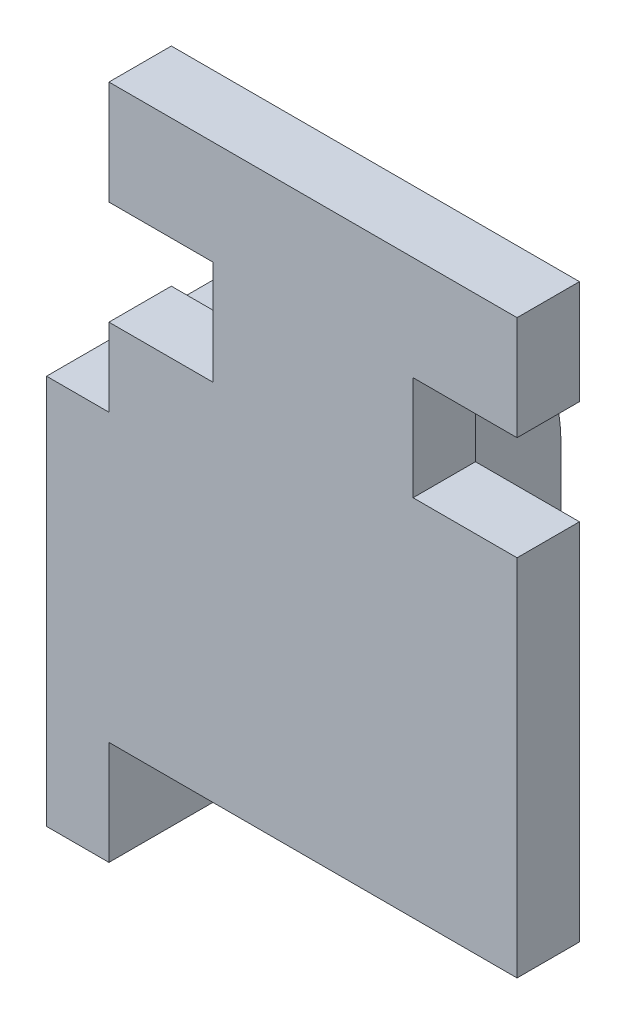
ISO-10303-21;
HEADER;
FILE_DESCRIPTION(('STEP AP214'),'2;1');
FILE_NAME('part.step','',(''),(''),'','','');
FILE_SCHEMA(('AUTOMOTIVE_DESIGN { 1 0 10303 214 1 1 1 1 }'));
ENDSEC;
DATA;
#1=APPLICATION_CONTEXT('core data for automotive mechanical design processes');
#2=APPLICATION_PROTOCOL_DEFINITION('international standard','automotive_design',2000,#1);
#3=PRODUCT_CONTEXT('',#1,'mechanical');
#4=PRODUCT('Part','Part','',(#3));
#5=PRODUCT_RELATED_PRODUCT_CATEGORY('part','',(#4));
#6=PRODUCT_DEFINITION_FORMATION('','',#4);
#7=PRODUCT_DEFINITION_CONTEXT('part definition',#1,'design');
#8=PRODUCT_DEFINITION('design','',#6,#7);
#9=PRODUCT_DEFINITION_SHAPE('','',#8);
#10=(LENGTH_UNIT() NAMED_UNIT(*) SI_UNIT(.MILLI.,.METRE.));
#11=(NAMED_UNIT(*) PLANE_ANGLE_UNIT() SI_UNIT($,.RADIAN.));
#12=(NAMED_UNIT(*) SI_UNIT($,.STERADIAN.) SOLID_ANGLE_UNIT());
#13=UNCERTAINTY_MEASURE_WITH_UNIT(LENGTH_MEASURE(1.E-05),#10,'distance_accuracy_value','');
#14=(GEOMETRIC_REPRESENTATION_CONTEXT(3) GLOBAL_UNCERTAINTY_ASSIGNED_CONTEXT((#13)) GLOBAL_UNIT_ASSIGNED_CONTEXT((#10,
#11,#12)) REPRESENTATION_CONTEXT('',''));
#15=CARTESIAN_POINT('',(0.,0.,0.));
#16=DIRECTION('',(0.,0.,1.));
#17=DIRECTION('',(1.,0.,0.));
#18=AXIS2_PLACEMENT_3D('',#15,#16,#17);
#19=CARTESIAN_POINT('',(0.,0.,0.24));
#20=DIRECTION('',(1.,0.,0.));
#21=DIRECTION('',(0.,0.,-1.));
#22=AXIS2_PLACEMENT_3D('',#19,#20,#21);
#23=PLANE('',#22);
#24=DIRECTION('',(0.,0.,-1.));
#25=VECTOR('',#24,1.);
#26=CARTESIAN_POINT('',(0.,1.1,-1.5));
#27=LINE('',#26,#25);
#28=CARTESIAN_POINT('',(0.,1.1,0.24));
#29=VERTEX_POINT('',#28);
#30=CARTESIAN_POINT('',(0.,1.1,0.));
#31=VERTEX_POINT('',#30);
#32=EDGE_CURVE('E285',#29,#31,#27,.T.);
#33=ORIENTED_EDGE('',*,*,#32,.F.);
#34=DIRECTION('',(0.,-1.,0.));
#35=VECTOR('',#34,1.);
#36=CARTESIAN_POINT('',(0.,0.,0.24));
#37=LINE('',#36,#35);
#38=CARTESIAN_POINT('',(0.,1.4,0.24));
#39=VERTEX_POINT('',#38);
#40=EDGE_CURVE('E177',#39,#29,#37,.T.);
#41=ORIENTED_EDGE('',*,*,#40,.F.);
#42=DIRECTION('',(0.,0.,-1.));
#43=VECTOR('',#42,1.);
#44=CARTESIAN_POINT('',(0.,1.4,0.24));
#45=LINE('',#44,#43);
#46=CARTESIAN_POINT('',(0.,1.4,0.));
#47=VERTEX_POINT('',#46);
#48=EDGE_CURVE('E238',#39,#47,#45,.T.);
#49=ORIENTED_EDGE('',*,*,#48,.T.);
#50=DIRECTION('',(0.,-1.,0.));
#51=VECTOR('',#50,1.);
#52=CARTESIAN_POINT('',(0.,0.,0.));
#53=LINE('',#52,#51);
#54=EDGE_CURVE('E192',#47,#31,#53,.T.);
#55=ORIENTED_EDGE('',*,*,#54,.T.);
#56=EDGE_LOOP('',(#33,#41,#49,#55));
#57=FACE_BOUND('',#56,.T.);
#58=ADVANCED_FACE('F34',(#57),#23,.F.);
#59=CARTESIAN_POINT('',(1.57,0.,0.24));
#60=DIRECTION('',(0.,1.,0.));
#61=DIRECTION('',(-1.,0.,0.));
#62=AXIS2_PLACEMENT_3D('',#59,#60,#61);
#63=PLANE('',#62);
#64=DIRECTION('',(1.,0.,0.));
#65=VECTOR('',#64,1.);
#66=CARTESIAN_POINT('',(1.57,0.,0.));
#67=LINE('',#66,#65);
#68=CARTESIAN_POINT('',(0.,0.,0.));
#69=VERTEX_POINT('',#68);
#70=CARTESIAN_POINT('',(1.57,0.,0.));
#71=VERTEX_POINT('',#70);
#72=EDGE_CURVE('E178',#69,#71,#67,.T.);
#73=ORIENTED_EDGE('',*,*,#72,.T.);
#74=DIRECTION('',(0.,0.,-1.));
#75=VECTOR('',#74,1.);
#76=CARTESIAN_POINT('',(1.57,0.,0.24));
#77=LINE('',#76,#75);
#78=CARTESIAN_POINT('',(1.57,0.,0.24));
#79=VERTEX_POINT('',#78);
#80=EDGE_CURVE('E268',#79,#71,#77,.T.);
#81=ORIENTED_EDGE('',*,*,#80,.F.);
#82=DIRECTION('',(1.,0.,0.));
#83=VECTOR('',#82,1.);
#84=CARTESIAN_POINT('',(1.57,0.,0.24));
#85=LINE('',#84,#83);
#86=CARTESIAN_POINT('',(0.,0.,0.24));
#87=VERTEX_POINT('',#86);
#88=EDGE_CURVE('E189',#87,#79,#85,.T.);
#89=ORIENTED_EDGE('',*,*,#88,.F.);
#90=DIRECTION('',(0.,0.,-1.));
#91=VECTOR('',#90,1.);
#92=CARTESIAN_POINT('',(0.,0.,0.24));
#93=LINE('',#92,#91);
#94=EDGE_CURVE('E212',#87,#69,#93,.T.);
#95=ORIENTED_EDGE('',*,*,#94,.T.);
#96=EDGE_LOOP('',(#73,#81,#89,#95));
#97=FACE_BOUND('',#96,.T.);
#98=ADVANCED_FACE('F306',(#97),#63,.F.);
#99=CARTESIAN_POINT('',(1.57,1.4,0.24));
#100=DIRECTION('',(-1.,0.,0.));
#101=DIRECTION('',(0.,0.,1.));
#102=AXIS2_PLACEMENT_3D('',#99,#100,#101);
#103=PLANE('',#102);
#104=DIRECTION('',(0.,1.,0.));
#105=VECTOR('',#104,1.);
#106=CARTESIAN_POINT('',(1.57,1.4,0.));
#107=LINE('',#106,#105);
#108=CARTESIAN_POINT('',(1.57,1.4,0.));
#109=VERTEX_POINT('',#108);
#110=EDGE_CURVE('E182',#71,#109,#107,.T.);
#111=ORIENTED_EDGE('',*,*,#110,.T.);
#112=DIRECTION('',(0.,0.,-1.));
#113=VECTOR('',#112,1.);
#114=CARTESIAN_POINT('',(1.57,1.4,0.24));
#115=LINE('',#114,#113);
#116=CARTESIAN_POINT('',(1.57,1.4,0.24));
#117=VERTEX_POINT('',#116);
#118=EDGE_CURVE('E265',#117,#109,#115,.T.);
#119=ORIENTED_EDGE('',*,*,#118,.F.);
#120=DIRECTION('',(0.,1.,0.));
#121=VECTOR('',#120,1.);
#122=CARTESIAN_POINT('',(1.57,1.4,0.24));
#123=LINE('',#122,#121);
#124=EDGE_CURVE('E191',#79,#117,#123,.T.);
#125=ORIENTED_EDGE('',*,*,#124,.F.);
#126=ORIENTED_EDGE('',*,*,#80,.T.);
#127=EDGE_LOOP('',(#111,#119,#125,#126));
#128=FACE_BOUND('',#127,.T.);
#129=ADVANCED_FACE('F312',(#128),#103,.F.);
#130=CARTESIAN_POINT('',(1.17,1.4,0.24));
#131=DIRECTION('',(0.,-1.,0.));
#132=DIRECTION('',(1.,0.,0.));
#133=AXIS2_PLACEMENT_3D('',#130,#131,#132);
#134=PLANE('',#133);
#135=DIRECTION('',(-1.,0.,0.));
#136=VECTOR('',#135,1.);
#137=CARTESIAN_POINT('',(1.17,1.4,0.));
#138=LINE('',#137,#136);
#139=CARTESIAN_POINT('',(1.17,1.4,0.));
#140=VERTEX_POINT('',#139);
#141=EDGE_CURVE('E215',#109,#140,#138,.T.);
#142=ORIENTED_EDGE('',*,*,#141,.T.);
#143=DIRECTION('',(0.,0.,-1.));
#144=VECTOR('',#143,1.);
#145=CARTESIAN_POINT('',(1.17,1.4,0.24));
#146=LINE('',#145,#144);
#147=CARTESIAN_POINT('',(1.17,1.4,0.24));
#148=VERTEX_POINT('',#147);
#149=EDGE_CURVE('E262',#148,#140,#146,.T.);
#150=ORIENTED_EDGE('',*,*,#149,.F.);
#151=DIRECTION('',(-1.,0.,0.));
#152=VECTOR('',#151,1.);
#153=CARTESIAN_POINT('',(1.17,1.4,0.24));
#154=LINE('',#153,#152);
#155=EDGE_CURVE('E194',#117,#148,#154,.T.);
#156=ORIENTED_EDGE('',*,*,#155,.F.);
#157=ORIENTED_EDGE('',*,*,#118,.T.);
#158=EDGE_LOOP('',(#142,#150,#156,#157));
#159=FACE_BOUND('',#158,.T.);
#160=ADVANCED_FACE('F349',(#159),#134,.F.);
#161=CARTESIAN_POINT('',(1.17,1.8,0.24));
#162=DIRECTION('',(-1.,0.,0.));
#163=DIRECTION('',(0.,0.,1.));
#164=AXIS2_PLACEMENT_3D('',#161,#162,#163);
#165=PLANE('',#164);
#166=DIRECTION('',(0.,1.,0.));
#167=VECTOR('',#166,1.);
#168=CARTESIAN_POINT('',(1.17,1.8,0.));
#169=LINE('',#168,#167);
#170=CARTESIAN_POINT('',(1.17,1.8,0.));
#171=VERTEX_POINT('',#170);
#172=EDGE_CURVE('E217',#140,#171,#169,.T.);
#173=ORIENTED_EDGE('',*,*,#172,.T.);
#174=DIRECTION('',(0.,0.,-1.));
#175=VECTOR('',#174,1.);
#176=CARTESIAN_POINT('',(1.17,1.8,0.24));
#177=LINE('',#176,#175);
#178=CARTESIAN_POINT('',(1.17,1.8,0.24));
#179=VERTEX_POINT('',#178);
#180=EDGE_CURVE('E259',#179,#171,#177,.T.);
#181=ORIENTED_EDGE('',*,*,#180,.F.);
#182=DIRECTION('',(0.,1.,0.));
#183=VECTOR('',#182,1.);
#184=CARTESIAN_POINT('',(1.17,1.8,0.24));
#185=LINE('',#184,#183);
#186=EDGE_CURVE('E196',#148,#179,#185,.T.);
#187=ORIENTED_EDGE('',*,*,#186,.F.);
#188=ORIENTED_EDGE('',*,*,#149,.T.);
#189=EDGE_LOOP('',(#173,#181,#187,#188));
#190=FACE_BOUND('',#189,.T.);
#191=ADVANCED_FACE('F345',(#190),#165,.F.);
#192=CARTESIAN_POINT('',(1.57,1.8,0.24));
#193=DIRECTION('',(0.,1.,0.));
#194=DIRECTION('',(0.,0.,1.));
#195=AXIS2_PLACEMENT_3D('',#192,#193,#194);
#196=PLANE('',#195);
#197=DIRECTION('',(1.,0.,0.));
#198=VECTOR('',#197,1.);
#199=CARTESIAN_POINT('',(1.57,1.8,0.));
#200=LINE('',#199,#198);
#201=CARTESIAN_POINT('',(1.57,1.8,0.));
#202=VERTEX_POINT('',#201);
#203=EDGE_CURVE('E219',#171,#202,#200,.T.);
#204=ORIENTED_EDGE('',*,*,#203,.T.);
#205=DIRECTION('',(0.,0.,-1.));
#206=VECTOR('',#205,1.);
#207=CARTESIAN_POINT('',(1.57,1.8,0.24));
#208=LINE('',#207,#206);
#209=CARTESIAN_POINT('',(1.57,1.8,0.24));
#210=VERTEX_POINT('',#209);
#211=EDGE_CURVE('E256',#210,#202,#208,.T.);
#212=ORIENTED_EDGE('',*,*,#211,.F.);
#213=DIRECTION('',(1.,0.,0.));
#214=VECTOR('',#213,1.);
#215=CARTESIAN_POINT('',(1.57,1.8,0.24));
#216=LINE('',#215,#214);
#217=EDGE_CURVE('E198',#179,#210,#216,.T.);
#218=ORIENTED_EDGE('',*,*,#217,.F.);
#219=ORIENTED_EDGE('',*,*,#180,.T.);
#220=EDGE_LOOP('',(#204,#212,#218,#219));
#221=FACE_BOUND('',#220,.T.);
#222=ADVANCED_FACE('F341',(#221),#196,.F.);
#223=CARTESIAN_POINT('',(1.57,2.2,0.24));
#224=DIRECTION('',(-1.,0.,0.));
#225=DIRECTION('',(0.,0.,1.));
#226=AXIS2_PLACEMENT_3D('',#223,#224,#225);
#227=PLANE('',#226);
#228=DIRECTION('',(0.,1.,0.));
#229=VECTOR('',#228,1.);
#230=CARTESIAN_POINT('',(1.57,2.2,0.));
#231=LINE('',#230,#229);
#232=CARTESIAN_POINT('',(1.57,2.2,0.));
#233=VERTEX_POINT('',#232);
#234=EDGE_CURVE('E221',#202,#233,#231,.T.);
#235=ORIENTED_EDGE('',*,*,#234,.T.);
#236=DIRECTION('',(0.,0.,-1.));
#237=VECTOR('',#236,1.);
#238=CARTESIAN_POINT('',(1.57,2.2,0.24));
#239=LINE('',#238,#237);
#240=CARTESIAN_POINT('',(1.57,2.2,0.24));
#241=VERTEX_POINT('',#240);
#242=EDGE_CURVE('E253',#241,#233,#239,.T.);
#243=ORIENTED_EDGE('',*,*,#242,.F.);
#244=DIRECTION('',(0.,1.,0.));
#245=VECTOR('',#244,1.);
#246=CARTESIAN_POINT('',(1.57,2.2,0.24));
#247=LINE('',#246,#245);
#248=EDGE_CURVE('E200',#210,#241,#247,.T.);
#249=ORIENTED_EDGE('',*,*,#248,.F.);
#250=ORIENTED_EDGE('',*,*,#211,.T.);
#251=EDGE_LOOP('',(#235,#243,#249,#250));
#252=FACE_BOUND('',#251,.T.);
#253=ADVANCED_FACE('F337',(#252),#227,.F.);
#254=CARTESIAN_POINT('',(0.,2.2,0.24));
#255=DIRECTION('',(0.,-1.,0.));
#256=DIRECTION('',(0.,0.,-1.));
#257=AXIS2_PLACEMENT_3D('',#254,#255,#256);
#258=PLANE('',#257);
#259=DIRECTION('',(-1.,0.,0.));
#260=VECTOR('',#259,1.);
#261=CARTESIAN_POINT('',(0.,2.2,0.));
#262=LINE('',#261,#260);
#263=CARTESIAN_POINT('',(0.,2.2,0.));
#264=VERTEX_POINT('',#263);
#265=EDGE_CURVE('E223',#233,#264,#262,.T.);
#266=ORIENTED_EDGE('',*,*,#265,.T.);
#267=DIRECTION('',(0.,0.,-1.));
#268=VECTOR('',#267,1.);
#269=CARTESIAN_POINT('',(0.,2.2,0.24));
#270=LINE('',#269,#268);
#271=CARTESIAN_POINT('',(0.,2.2,0.24));
#272=VERTEX_POINT('',#271);
#273=EDGE_CURVE('E250',#272,#264,#270,.T.);
#274=ORIENTED_EDGE('',*,*,#273,.F.);
#275=DIRECTION('',(-1.,0.,0.));
#276=VECTOR('',#275,1.);
#277=CARTESIAN_POINT('',(0.,2.2,0.24));
#278=LINE('',#277,#276);
#279=EDGE_CURVE('E202',#241,#272,#278,.T.);
#280=ORIENTED_EDGE('',*,*,#279,.F.);
#281=ORIENTED_EDGE('',*,*,#242,.T.);
#282=EDGE_LOOP('',(#266,#274,#280,#281));
#283=FACE_BOUND('',#282,.T.);
#284=ADVANCED_FACE('F333',(#283),#258,.F.);
#285=CARTESIAN_POINT('',(0.,1.8,0.24));
#286=DIRECTION('',(1.,0.,0.));
#287=DIRECTION('',(0.,0.,-1.));
#288=AXIS2_PLACEMENT_3D('',#285,#286,#287);
#289=PLANE('',#288);
#290=DIRECTION('',(0.,-1.,0.));
#291=VECTOR('',#290,1.);
#292=CARTESIAN_POINT('',(0.,1.8,0.));
#293=LINE('',#292,#291);
#294=CARTESIAN_POINT('',(0.,1.8,0.));
#295=VERTEX_POINT('',#294);
#296=EDGE_CURVE('E225',#264,#295,#293,.T.);
#297=ORIENTED_EDGE('',*,*,#296,.T.);
#298=DIRECTION('',(0.,0.,-1.));
#299=VECTOR('',#298,1.);
#300=CARTESIAN_POINT('',(0.,1.8,0.24));
#301=LINE('',#300,#299);
#302=CARTESIAN_POINT('',(0.,1.8,0.24));
#303=VERTEX_POINT('',#302);
#304=EDGE_CURVE('E247',#303,#295,#301,.T.);
#305=ORIENTED_EDGE('',*,*,#304,.F.);
#306=DIRECTION('',(0.,-1.,0.));
#307=VECTOR('',#306,1.);
#308=CARTESIAN_POINT('',(0.,1.8,0.24));
#309=LINE('',#308,#307);
#310=EDGE_CURVE('E204',#272,#303,#309,.T.);
#311=ORIENTED_EDGE('',*,*,#310,.F.);
#312=ORIENTED_EDGE('',*,*,#273,.T.);
#313=EDGE_LOOP('',(#297,#305,#311,#312));
#314=FACE_BOUND('',#313,.T.);
#315=ADVANCED_FACE('F329',(#314),#289,.F.);
#316=CARTESIAN_POINT('',(0.4,1.8,0.24));
#317=DIRECTION('',(0.,1.,0.));
#318=DIRECTION('',(0.,0.,1.));
#319=AXIS2_PLACEMENT_3D('',#316,#317,#318);
#320=PLANE('',#319);
#321=DIRECTION('',(1.,0.,0.));
#322=VECTOR('',#321,1.);
#323=CARTESIAN_POINT('',(0.4,1.8,0.));
#324=LINE('',#323,#322);
#325=CARTESIAN_POINT('',(0.4,1.8,0.));
#326=VERTEX_POINT('',#325);
#327=EDGE_CURVE('E227',#295,#326,#324,.T.);
#328=ORIENTED_EDGE('',*,*,#327,.T.);
#329=DIRECTION('',(0.,0.,-1.));
#330=VECTOR('',#329,1.);
#331=CARTESIAN_POINT('',(0.4,1.8,0.24));
#332=LINE('',#331,#330);
#333=CARTESIAN_POINT('',(0.4,1.8,0.24));
#334=VERTEX_POINT('',#333);
#335=EDGE_CURVE('E244',#334,#326,#332,.T.);
#336=ORIENTED_EDGE('',*,*,#335,.F.);
#337=DIRECTION('',(1.,0.,0.));
#338=VECTOR('',#337,1.);
#339=CARTESIAN_POINT('',(0.4,1.8,0.24));
#340=LINE('',#339,#338);
#341=EDGE_CURVE('E206',#303,#334,#340,.T.);
#342=ORIENTED_EDGE('',*,*,#341,.F.);
#343=ORIENTED_EDGE('',*,*,#304,.T.);
#344=EDGE_LOOP('',(#328,#336,#342,#343));
#345=FACE_BOUND('',#344,.T.);
#346=ADVANCED_FACE('F325',(#345),#320,.F.);
#347=CARTESIAN_POINT('',(0.4,1.4,0.24));
#348=DIRECTION('',(1.,0.,0.));
#349=DIRECTION('',(0.,1.,0.));
#350=AXIS2_PLACEMENT_3D('',#347,#348,#349);
#351=PLANE('',#350);
#352=DIRECTION('',(0.,-1.,0.));
#353=VECTOR('',#352,1.);
#354=CARTESIAN_POINT('',(0.4,1.4,0.));
#355=LINE('',#354,#353);
#356=CARTESIAN_POINT('',(0.4,1.4,0.));
#357=VERTEX_POINT('',#356);
#358=EDGE_CURVE('E229',#326,#357,#355,.T.);
#359=ORIENTED_EDGE('',*,*,#358,.T.);
#360=DIRECTION('',(0.,0.,-1.));
#361=VECTOR('',#360,1.);
#362=CARTESIAN_POINT('',(0.4,1.4,0.24));
#363=LINE('',#362,#361);
#364=CARTESIAN_POINT('',(0.4,1.4,0.24));
#365=VERTEX_POINT('',#364);
#366=EDGE_CURVE('E241',#365,#357,#363,.T.);
#367=ORIENTED_EDGE('',*,*,#366,.F.);
#368=DIRECTION('',(0.,-1.,0.));
#369=VECTOR('',#368,1.);
#370=CARTESIAN_POINT('',(0.4,1.4,0.24));
#371=LINE('',#370,#369);
#372=EDGE_CURVE('E208',#334,#365,#371,.T.);
#373=ORIENTED_EDGE('',*,*,#372,.F.);
#374=ORIENTED_EDGE('',*,*,#335,.T.);
#375=EDGE_LOOP('',(#359,#367,#373,#374));
#376=FACE_BOUND('',#375,.T.);
#377=ADVANCED_FACE('F321',(#376),#351,.F.);
#378=CARTESIAN_POINT('',(0.,1.4,0.24));
#379=DIRECTION('',(0.,-1.,0.));
#380=DIRECTION('',(0.,0.,-1.));
#381=AXIS2_PLACEMENT_3D('',#378,#379,#380);
#382=PLANE('',#381);
#383=DIRECTION('',(-1.,0.,0.));
#384=VECTOR('',#383,1.);
#385=CARTESIAN_POINT('',(0.,1.4,0.));
#386=LINE('',#385,#384);
#387=EDGE_CURVE('E231',#357,#47,#386,.T.);
#388=ORIENTED_EDGE('',*,*,#387,.T.);
#389=ORIENTED_EDGE('',*,*,#48,.F.);
#390=DIRECTION('',(-1.,0.,0.));
#391=VECTOR('',#390,1.);
#392=CARTESIAN_POINT('',(0.,1.4,0.24));
#393=LINE('',#392,#391);
#394=EDGE_CURVE('E210',#365,#39,#393,.T.);
#395=ORIENTED_EDGE('',*,*,#394,.F.);
#396=ORIENTED_EDGE('',*,*,#366,.T.);
#397=EDGE_LOOP('',(#388,#389,#395,#396));
#398=FACE_BOUND('',#397,.T.);
#399=ADVANCED_FACE('F318',(#398),#382,.F.);
#400=CARTESIAN_POINT('',(0.,0.,0.24));
#401=DIRECTION('',(0.,0.,-1.));
#402=DIRECTION('',(-1.,0.,0.));
#403=AXIS2_PLACEMENT_3D('',#400,#401,#402);
#404=PLANE('',#403);
#405=ORIENTED_EDGE('',*,*,#88,.T.);
#406=ORIENTED_EDGE('',*,*,#124,.T.);
#407=ORIENTED_EDGE('',*,*,#155,.T.);
#408=ORIENTED_EDGE('',*,*,#186,.T.);
#409=ORIENTED_EDGE('',*,*,#217,.T.);
#410=ORIENTED_EDGE('',*,*,#248,.T.);
#411=ORIENTED_EDGE('',*,*,#279,.T.);
#412=ORIENTED_EDGE('',*,*,#310,.T.);
#413=ORIENTED_EDGE('',*,*,#341,.T.);
#414=ORIENTED_EDGE('',*,*,#372,.T.);
#415=ORIENTED_EDGE('',*,*,#394,.T.);
#416=ORIENTED_EDGE('',*,*,#40,.T.);
#417=DIRECTION('',(1.,0.,0.));
#418=VECTOR('',#417,1.);
#419=CARTESIAN_POINT('',(-0.24,1.1,0.24));
#420=LINE('',#419,#418);
#421=CARTESIAN_POINT('',(-0.24,1.1,0.24));
#422=VERTEX_POINT('',#421);
#423=EDGE_CURVE('E158',#422,#29,#420,.T.);
#424=ORIENTED_EDGE('',*,*,#423,.F.);
#425=DIRECTION('',(0.,1.,0.));
#426=VECTOR('',#425,1.);
#427=CARTESIAN_POINT('',(-0.24,1.1,0.24));
#428=LINE('',#427,#426);
#429=CARTESIAN_POINT('',(-0.24,-0.4,0.24));
#430=VERTEX_POINT('',#429);
#431=EDGE_CURVE('E162',#430,#422,#428,.T.);
#432=ORIENTED_EDGE('',*,*,#431,.F.);
#433=DIRECTION('',(1.,0.,0.));
#434=VECTOR('',#433,1.);
#435=CARTESIAN_POINT('',(-0.24,-0.4,0.24));
#436=LINE('',#435,#434);
#437=CARTESIAN_POINT('',(0.,-0.4,0.24));
#438=VERTEX_POINT('',#437);
#439=EDGE_CURVE('E185',#430,#438,#436,.T.);
#440=ORIENTED_EDGE('',*,*,#439,.T.);
#441=DIRECTION('',(0.,1.,0.));
#442=VECTOR('',#441,1.);
#443=CARTESIAN_POINT('',(0.,0.,0.24));
#444=LINE('',#443,#442);
#445=EDGE_CURVE('E171',#438,#87,#444,.T.);
#446=ORIENTED_EDGE('',*,*,#445,.T.);
#447=EDGE_LOOP('',(#405,#406,#407,#408,#409,#410,#411,#412,#413,#414,#415,#416,#424,#432,#440,#446));
#448=FACE_BOUND('',#447,.T.);
#449=ADVANCED_FACE('F175',(#448),#404,.F.);
#450=CARTESIAN_POINT('',(0.,0.,0.));
#451=DIRECTION('',(0.,0.,-1.));
#452=DIRECTION('',(-1.,0.,0.));
#453=AXIS2_PLACEMENT_3D('',#450,#451,#452);
#454=PLANE('',#453);
#455=ORIENTED_EDGE('',*,*,#72,.F.);
#456=EDGE_CURVE('E233',#31,#69,#53,.T.);
#457=ORIENTED_EDGE('',*,*,#456,.F.);
#458=ORIENTED_EDGE('',*,*,#54,.F.);
#459=ORIENTED_EDGE('',*,*,#387,.F.);
#460=ORIENTED_EDGE('',*,*,#358,.F.);
#461=ORIENTED_EDGE('',*,*,#327,.F.);
#462=ORIENTED_EDGE('',*,*,#296,.F.);
#463=ORIENTED_EDGE('',*,*,#265,.F.);
#464=ORIENTED_EDGE('',*,*,#234,.F.);
#465=ORIENTED_EDGE('',*,*,#203,.F.);
#466=ORIENTED_EDGE('',*,*,#172,.F.);
#467=ORIENTED_EDGE('',*,*,#141,.F.);
#468=ORIENTED_EDGE('',*,*,#110,.F.);
#469=EDGE_LOOP('',(#455,#457,#458,#459,#460,#461,#462,#463,#464,#465,#466,#467,#468));
#470=FACE_BOUND('',#469,.T.);
#471=ADVANCED_FACE('F316',(#470),#454,.T.);
#472=CARTESIAN_POINT('',(0.,0.,0.));
#473=DIRECTION('',(-1.,0.,0.));
#474=DIRECTION('',(0.,0.,1.));
#475=AXIS2_PLACEMENT_3D('',#472,#473,#474);
#476=PLANE('',#475);
#477=DIRECTION('',(0.,-1.,0.));
#478=VECTOR('',#477,1.);
#479=CARTESIAN_POINT('',(0.,-0.4,-1.5));
#480=LINE('',#479,#478);
#481=CARTESIAN_POINT('',(0.,0.0999999999999995,-1.5));
#482=VERTEX_POINT('',#481);
#483=CARTESIAN_POINT('',(0.,-0.4,-1.5));
#484=VERTEX_POINT('',#483);
#485=EDGE_CURVE('E279',#482,#484,#480,.T.);
#486=ORIENTED_EDGE('',*,*,#485,.F.);
#487=CARTESIAN_POINT('',(0.,0.0999999999999999,-0.5));
#488=DIRECTION('',(-1.,0.,0.));
#489=DIRECTION('',(0.,0.,1.));
#490=AXIS2_PLACEMENT_3D('',#487,#488,#489);
#491=CIRCLE('',#490,1.);
#492=CARTESIAN_POINT('',(0.,1.1,-0.5));
#493=VERTEX_POINT('',#492);
#494=EDGE_CURVE('E56',#482,#493,#491,.F.);
#495=ORIENTED_EDGE('',*,*,#494,.T.);
#496=EDGE_CURVE('E288',#31,#493,#27,.T.);
#497=ORIENTED_EDGE('',*,*,#496,.F.);
#498=ORIENTED_EDGE('',*,*,#456,.T.);
#499=ORIENTED_EDGE('',*,*,#94,.F.);
#500=ORIENTED_EDGE('',*,*,#445,.F.);
#501=DIRECTION('',(0.,0.,1.));
#502=VECTOR('',#501,1.);
#503=CARTESIAN_POINT('',(0.,-0.4,-1.5));
#504=LINE('',#503,#502);
#505=EDGE_CURVE('E284',#484,#438,#504,.T.);
#506=ORIENTED_EDGE('',*,*,#505,.F.);
#507=EDGE_LOOP('',(#486,#495,#497,#498,#499,#500,#506));
#508=FACE_BOUND('',#507,.T.);
#509=ADVANCED_FACE('F282',(#508),#476,.F.);
#510=CARTESIAN_POINT('',(-0.24,1.1,-1.5));
#511=DIRECTION('',(0.,-1.,0.));
#512=DIRECTION('',(0.,0.,-1.));
#513=AXIS2_PLACEMENT_3D('',#510,#511,#512);
#514=PLANE('',#513);
#515=ORIENTED_EDGE('',*,*,#496,.T.);
#516=DIRECTION('',(1.,0.,0.));
#517=VECTOR('',#516,1.);
#518=CARTESIAN_POINT('',(-0.24,1.1,-0.5));
#519=LINE('',#518,#517);
#520=CARTESIAN_POINT('',(-0.24,1.1,-0.5));
#521=VERTEX_POINT('',#520);
#522=EDGE_CURVE('E42',#493,#521,#519,.F.);
#523=ORIENTED_EDGE('',*,*,#522,.T.);
#524=DIRECTION('',(0.,0.,-1.));
#525=VECTOR('',#524,1.);
#526=CARTESIAN_POINT('',(-0.24,1.1,0.));
#527=LINE('',#526,#525);
#528=EDGE_CURVE('E153',#422,#521,#527,.T.);
#529=ORIENTED_EDGE('',*,*,#528,.F.);
#530=ORIENTED_EDGE('',*,*,#423,.T.);
#531=ORIENTED_EDGE('',*,*,#32,.T.);
#532=EDGE_LOOP('',(#515,#523,#529,#530,#531));
#533=FACE_BOUND('',#532,.T.);
#534=ADVANCED_FACE('F155',(#533),#514,.F.);
#535=CARTESIAN_POINT('',(-0.24,-0.4,-1.5));
#536=DIRECTION('',(0.,0.,1.));
#537=DIRECTION('',(0.,-1.,0.));
#538=AXIS2_PLACEMENT_3D('',#535,#536,#537);
#539=PLANE('',#538);
#540=DIRECTION('',(0.,-1.,0.));
#541=VECTOR('',#540,1.);
#542=CARTESIAN_POINT('',(-0.24,-0.4,-1.5));
#543=LINE('',#542,#541);
#544=CARTESIAN_POINT('',(-0.24,0.0999999999999995,-1.5));
#545=VERTEX_POINT('',#544);
#546=CARTESIAN_POINT('',(-0.24,-0.4,-1.5));
#547=VERTEX_POINT('',#546);
#548=EDGE_CURVE('E161',#545,#547,#543,.T.);
#549=ORIENTED_EDGE('',*,*,#548,.F.);
#550=DIRECTION('',(1.,0.,0.));
#551=VECTOR('',#550,1.);
#552=CARTESIAN_POINT('',(-0.24,0.0999999999999995,-1.5));
#553=LINE('',#552,#551);
#554=EDGE_CURVE('E271',#545,#482,#553,.T.);
#555=ORIENTED_EDGE('',*,*,#554,.T.);
#556=ORIENTED_EDGE('',*,*,#485,.T.);
#557=DIRECTION('',(1.,0.,0.));
#558=VECTOR('',#557,1.);
#559=CARTESIAN_POINT('',(-0.24,-0.4,-1.5));
#560=LINE('',#559,#558);
#561=EDGE_CURVE('E179',#547,#484,#560,.T.);
#562=ORIENTED_EDGE('',*,*,#561,.F.);
#563=EDGE_LOOP('',(#549,#555,#556,#562));
#564=FACE_BOUND('',#563,.T.);
#565=ADVANCED_FACE('F277',(#564),#539,.F.);
#566=CARTESIAN_POINT('',(-0.24,-0.4,-1.5));
#567=DIRECTION('',(0.,1.,0.));
#568=DIRECTION('',(0.,0.,1.));
#569=AXIS2_PLACEMENT_3D('',#566,#567,#568);
#570=PLANE('',#569);
#571=ORIENTED_EDGE('',*,*,#505,.T.);
#572=ORIENTED_EDGE('',*,*,#439,.F.);
#573=DIRECTION('',(0.,0.,1.));
#574=VECTOR('',#573,1.);
#575=CARTESIAN_POINT('',(-0.24,-0.4,-1.5));
#576=LINE('',#575,#574);
#577=EDGE_CURVE('E167',#547,#430,#576,.T.);
#578=ORIENTED_EDGE('',*,*,#577,.F.);
#579=ORIENTED_EDGE('',*,*,#561,.T.);
#580=EDGE_LOOP('',(#571,#572,#578,#579));
#581=FACE_BOUND('',#580,.T.);
#582=ADVANCED_FACE('F295',(#581),#570,.F.);
#583=CARTESIAN_POINT('',(-0.24,0.,0.));
#584=DIRECTION('',(-1.,0.,0.));
#585=DIRECTION('',(0.,0.,1.));
#586=AXIS2_PLACEMENT_3D('',#583,#584,#585);
#587=PLANE('',#586);
#588=ORIENTED_EDGE('',*,*,#528,.T.);
#589=CARTESIAN_POINT('',(-0.24,0.0999999999999999,-0.5));
#590=DIRECTION('',(-1.,0.,0.));
#591=DIRECTION('',(0.,0.,1.));
#592=AXIS2_PLACEMENT_3D('',#589,#590,#591);
#593=CIRCLE('',#592,1.);
#594=EDGE_CURVE('E11',#521,#545,#593,.T.);
#595=ORIENTED_EDGE('',*,*,#594,.T.);
#596=ORIENTED_EDGE('',*,*,#548,.T.);
#597=ORIENTED_EDGE('',*,*,#577,.T.);
#598=ORIENTED_EDGE('',*,*,#431,.T.);
#599=EDGE_LOOP('',(#588,#595,#596,#597,#598));
#600=FACE_BOUND('',#599,.T.);
#601=ADVANCED_FACE('F165',(#600),#587,.T.);
#602=CARTESIAN_POINT('',(-0.24,0.0999999999999999,-0.5));
#603=DIRECTION('',(1.,0.,0.));
#604=DIRECTION('',(0.,0.,-1.));
#605=AXIS2_PLACEMENT_3D('',#602,#603,#604);
#606=CYLINDRICAL_SURFACE('',#605,1.);
#607=ORIENTED_EDGE('',*,*,#594,.F.);
#608=ORIENTED_EDGE('',*,*,#522,.F.);
#609=ORIENTED_EDGE('',*,*,#494,.F.);
#610=ORIENTED_EDGE('',*,*,#554,.F.);
#611=EDGE_LOOP('',(#607,#608,#609,#610));
#612=FACE_BOUND('',#611,.T.);
#613=ADVANCED_FACE('F36',(#612),#606,.T.);
#614=CLOSED_SHELL('',(#58,#98,#129,#160,#191,#222,#253,#284,#315,#346,#377,#399,#449,#471,#509,
#534,#565,#582,#601,#613));
#615=MANIFOLD_SOLID_BREP('B2',#614);
#616=ADVANCED_BREP_SHAPE_REPRESENTATION('',(#18,#615),#14);
#617=SHAPE_DEFINITION_REPRESENTATION(#9,#616);
ENDSEC;
END-ISO-10303-21;
